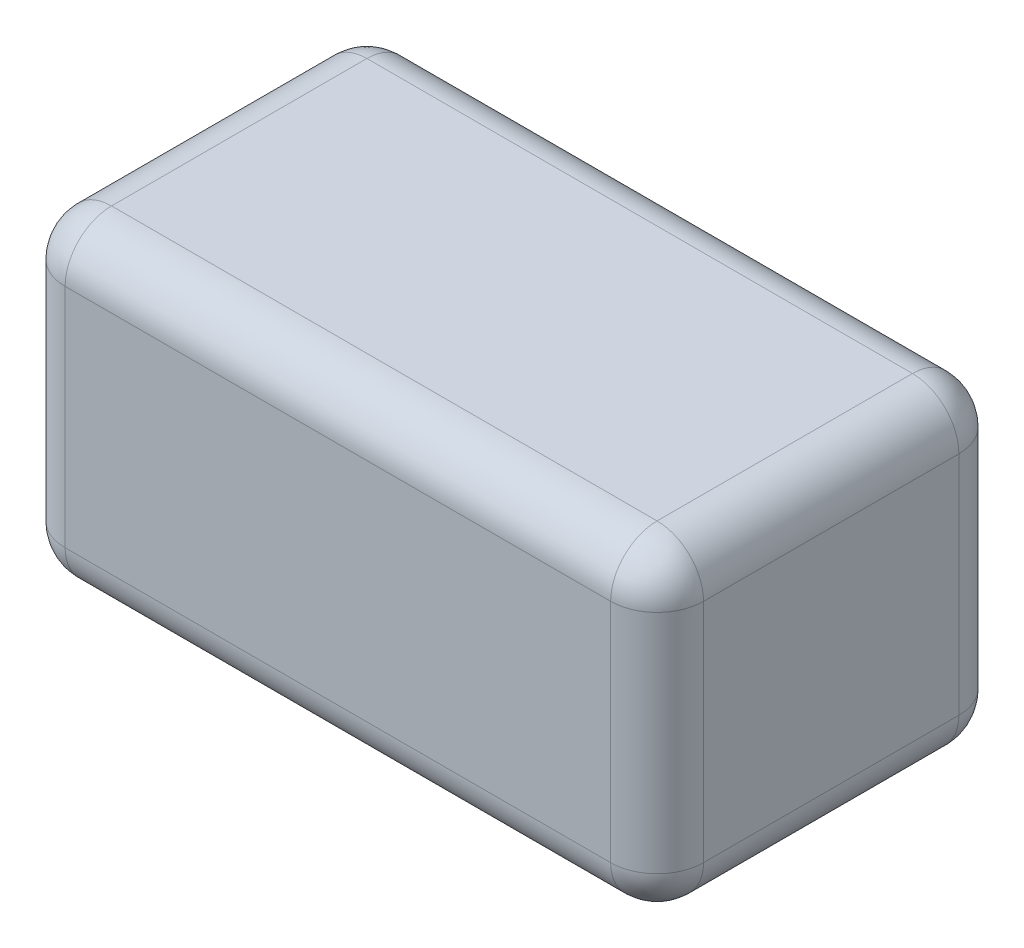
ISO-10303-21;
HEADER;
FILE_DESCRIPTION(('STEP AP214'),'2;1');
FILE_NAME('part.step','',(''),(''),'','','');
FILE_SCHEMA(('AUTOMOTIVE_DESIGN { 1 0 10303 214 1 1 1 1 }'));
ENDSEC;
DATA;
#1=APPLICATION_CONTEXT('core data for automotive mechanical design processes');
#2=APPLICATION_PROTOCOL_DEFINITION('international standard','automotive_design',2000,#1);
#3=PRODUCT_CONTEXT('',#1,'mechanical');
#4=PRODUCT('Part','Part','',(#3));
#5=PRODUCT_RELATED_PRODUCT_CATEGORY('part','',(#4));
#6=PRODUCT_DEFINITION_FORMATION('','',#4);
#7=PRODUCT_DEFINITION_CONTEXT('part definition',#1,'design');
#8=PRODUCT_DEFINITION('design','',#6,#7);
#9=PRODUCT_DEFINITION_SHAPE('','',#8);
#10=(LENGTH_UNIT() NAMED_UNIT(*) SI_UNIT(.MILLI.,.METRE.));
#11=(NAMED_UNIT(*) PLANE_ANGLE_UNIT() SI_UNIT($,.RADIAN.));
#12=(NAMED_UNIT(*) SI_UNIT($,.STERADIAN.) SOLID_ANGLE_UNIT());
#13=UNCERTAINTY_MEASURE_WITH_UNIT(LENGTH_MEASURE(1.E-05),#10,'distance_accuracy_value','');
#14=(GEOMETRIC_REPRESENTATION_CONTEXT(3) GLOBAL_UNCERTAINTY_ASSIGNED_CONTEXT((#13)) GLOBAL_UNIT_ASSIGNED_CONTEXT((#10,
#11,#12)) REPRESENTATION_CONTEXT('',''));
#15=CARTESIAN_POINT('',(0.,0.,0.));
#16=DIRECTION('',(0.,0.,1.));
#17=DIRECTION('',(1.,0.,0.));
#18=AXIS2_PLACEMENT_3D('',#15,#16,#17);
#19=CARTESIAN_POINT('',(0.47,0.195,0.52));
#20=DIRECTION('',(0.,1.,0.));
#21=DIRECTION('',(0.,0.,1.));
#22=AXIS2_PLACEMENT_3D('',#19,#20,#21);
#23=SPHERICAL_SURFACE('',#22,0.08);
#24=CARTESIAN_POINT('',(0.47,0.195,0.52));
#25=DIRECTION('',(0.,0.,-1.));
#26=DIRECTION('',(0.,1.,0.));
#27=AXIS2_PLACEMENT_3D('',#24,#25,#26);
#28=CIRCLE('',#27,0.08);
#29=CARTESIAN_POINT('',(0.47,0.275,0.52));
#30=VERTEX_POINT('',#29);
#31=CARTESIAN_POINT('',(0.55,0.195,0.52));
#32=VERTEX_POINT('',#31);
#33=EDGE_CURVE('E26',#30,#32,#28,.T.);
#34=ORIENTED_EDGE('',*,*,#33,.F.);
#35=CARTESIAN_POINT('',(0.47,0.195,0.52));
#36=DIRECTION('',(-1.,0.,0.));
#37=DIRECTION('',(0.,0.,1.));
#38=AXIS2_PLACEMENT_3D('',#35,#36,#37);
#39=CIRCLE('',#38,0.08);
#40=CARTESIAN_POINT('',(0.47,0.195,0.6));
#41=VERTEX_POINT('',#40);
#42=EDGE_CURVE('E236',#41,#30,#39,.T.);
#43=ORIENTED_EDGE('',*,*,#42,.F.);
#44=CARTESIAN_POINT('',(0.47,0.195,0.52));
#45=DIRECTION('',(0.,1.,0.));
#46=DIRECTION('',(0.,0.,1.));
#47=AXIS2_PLACEMENT_3D('',#44,#45,#46);
#48=CIRCLE('',#47,0.08);
#49=EDGE_CURVE('E11',#41,#32,#48,.T.);
#50=ORIENTED_EDGE('',*,*,#49,.T.);
#51=EDGE_LOOP('',(#34,#43,#50));
#52=FACE_BOUND('',#51,.T.);
#53=ADVANCED_FACE('F17',(#52),#23,.T.);
#54=CARTESIAN_POINT('',(-0.47,0.195,0.52));
#55=DIRECTION('',(0.,1.,0.));
#56=DIRECTION('',(-1.,0.,0.));
#57=AXIS2_PLACEMENT_3D('',#54,#55,#56);
#58=SPHERICAL_SURFACE('',#57,0.08);
#59=CARTESIAN_POINT('',(-0.47,0.195,0.52));
#60=DIRECTION('',(0.,0.,-1.));
#61=DIRECTION('',(-1.,0.,0.));
#62=AXIS2_PLACEMENT_3D('',#59,#60,#61);
#63=CIRCLE('',#62,0.08);
#64=CARTESIAN_POINT('',(-0.55,0.195,0.52));
#65=VERTEX_POINT('',#64);
#66=CARTESIAN_POINT('',(-0.47,0.275,0.52));
#67=VERTEX_POINT('',#66);
#68=EDGE_CURVE('E232',#65,#67,#63,.T.);
#69=ORIENTED_EDGE('',*,*,#68,.F.);
#70=CARTESIAN_POINT('',(-0.47,0.195,0.52));
#71=DIRECTION('',(0.,1.,0.));
#72=DIRECTION('',(-1.,0.,0.));
#73=AXIS2_PLACEMENT_3D('',#70,#71,#72);
#74=CIRCLE('',#73,0.08);
#75=CARTESIAN_POINT('',(-0.47,0.195,0.6));
#76=VERTEX_POINT('',#75);
#77=EDGE_CURVE('E20',#65,#76,#74,.T.);
#78=ORIENTED_EDGE('',*,*,#77,.T.);
#79=CARTESIAN_POINT('',(-0.47,0.195,0.52));
#80=DIRECTION('',(1.,0.,0.));
#81=DIRECTION('',(0.,1.,0.));
#82=AXIS2_PLACEMENT_3D('',#79,#80,#81);
#83=CIRCLE('',#82,0.08);
#84=EDGE_CURVE('E311',#67,#76,#83,.T.);
#85=ORIENTED_EDGE('',*,*,#84,.F.);
#86=EDGE_LOOP('',(#69,#78,#85));
#87=FACE_BOUND('',#86,.T.);
#88=ADVANCED_FACE('F324',(#87),#58,.T.);
#89=CARTESIAN_POINT('',(0.47,-0.595,0.52));
#90=DIRECTION('',(0.,-1.,0.));
#91=DIRECTION('',(1.,0.,0.));
#92=AXIS2_PLACEMENT_3D('',#89,#90,#91);
#93=CYLINDRICAL_SURFACE('',#92,0.08);
#94=CARTESIAN_POINT('',(0.47,-0.195,0.52));
#95=DIRECTION('',(0.,-1.,0.));
#96=DIRECTION('',(1.,0.,0.));
#97=AXIS2_PLACEMENT_3D('',#94,#95,#96);
#98=CIRCLE('',#97,0.08);
#99=CARTESIAN_POINT('',(0.55,-0.195,0.52));
#100=VERTEX_POINT('',#99);
#101=CARTESIAN_POINT('',(0.47,-0.195,0.6));
#102=VERTEX_POINT('',#101);
#103=EDGE_CURVE('E282',#100,#102,#98,.T.);
#104=ORIENTED_EDGE('',*,*,#103,.F.);
#105=DIRECTION('',(0.,1.,0.));
#106=VECTOR('',#105,1.);
#107=CARTESIAN_POINT('',(0.55,-0.195,0.52));
#108=LINE('',#107,#106);
#109=EDGE_CURVE('E278',#100,#32,#108,.T.);
#110=ORIENTED_EDGE('',*,*,#109,.T.);
#111=ORIENTED_EDGE('',*,*,#49,.F.);
#112=DIRECTION('',(0.,1.,0.));
#113=VECTOR('',#112,1.);
#114=CARTESIAN_POINT('',(0.47,-0.195,0.6));
#115=LINE('',#114,#113);
#116=EDGE_CURVE('E307',#102,#41,#115,.T.);
#117=ORIENTED_EDGE('',*,*,#116,.F.);
#118=EDGE_LOOP('',(#104,#110,#111,#117));
#119=FACE_BOUND('',#118,.T.);
#120=ADVANCED_FACE('F351',(#119),#93,.T.);
#121=CARTESIAN_POINT('',(0.47,0.195,0.84));
#122=DIRECTION('',(0.,0.,-1.));
#123=DIRECTION('',(0.,1.,0.));
#124=AXIS2_PLACEMENT_3D('',#121,#122,#123);
#125=CYLINDRICAL_SURFACE('',#124,0.08);
#126=DIRECTION('',(0.,0.,-1.));
#127=VECTOR('',#126,1.);
#128=CARTESIAN_POINT('',(0.55,0.195,0.52));
#129=LINE('',#128,#127);
#130=CARTESIAN_POINT('',(0.55,0.195,0.08));
#131=VERTEX_POINT('',#130);
#132=EDGE_CURVE('E276',#32,#131,#129,.T.);
#133=ORIENTED_EDGE('',*,*,#132,.T.);
#134=CARTESIAN_POINT('',(0.47,0.195,0.08));
#135=DIRECTION('',(0.,0.,1.));
#136=DIRECTION('',(1.,0.,0.));
#137=AXIS2_PLACEMENT_3D('',#134,#135,#136);
#138=CIRCLE('',#137,0.08);
#139=CARTESIAN_POINT('',(0.47,0.275,0.08));
#140=VERTEX_POINT('',#139);
#141=EDGE_CURVE('E272',#131,#140,#138,.T.);
#142=ORIENTED_EDGE('',*,*,#141,.T.);
#143=DIRECTION('',(0.,0.,-1.));
#144=VECTOR('',#143,1.);
#145=CARTESIAN_POINT('',(0.47,0.275,0.52));
#146=LINE('',#145,#144);
#147=EDGE_CURVE('E277',#30,#140,#146,.T.);
#148=ORIENTED_EDGE('',*,*,#147,.F.);
#149=ORIENTED_EDGE('',*,*,#33,.T.);
#150=EDGE_LOOP('',(#133,#142,#148,#149));
#151=FACE_BOUND('',#150,.T.);
#152=ADVANCED_FACE('F405',(#151),#125,.T.);
#153=CARTESIAN_POINT('',(-0.47,0.195,-0.24));
#154=DIRECTION('',(0.,0.,1.));
#155=DIRECTION('',(0.,1.,0.));
#156=AXIS2_PLACEMENT_3D('',#153,#154,#155);
#157=CYLINDRICAL_SURFACE('',#156,0.08);
#158=DIRECTION('',(0.,0.,1.));
#159=VECTOR('',#158,1.);
#160=CARTESIAN_POINT('',(-0.55,0.195,0.08));
#161=LINE('',#160,#159);
#162=CARTESIAN_POINT('',(-0.55,0.195,0.08));
#163=VERTEX_POINT('',#162);
#164=EDGE_CURVE('E291',#163,#65,#161,.T.);
#165=ORIENTED_EDGE('',*,*,#164,.T.);
#166=ORIENTED_EDGE('',*,*,#68,.T.);
#167=DIRECTION('',(0.,0.,1.));
#168=VECTOR('',#167,1.);
#169=CARTESIAN_POINT('',(-0.47,0.275,0.08));
#170=LINE('',#169,#168);
#171=CARTESIAN_POINT('',(-0.47,0.275,0.08));
#172=VERTEX_POINT('',#171);
#173=EDGE_CURVE('E298',#172,#67,#170,.T.);
#174=ORIENTED_EDGE('',*,*,#173,.F.);
#175=CARTESIAN_POINT('',(-0.47,0.195,0.08));
#176=DIRECTION('',(0.,0.,1.));
#177=DIRECTION('',(0.,1.,0.));
#178=AXIS2_PLACEMENT_3D('',#175,#176,#177);
#179=CIRCLE('',#178,0.08);
#180=EDGE_CURVE('E295',#172,#163,#179,.T.);
#181=ORIENTED_EDGE('',*,*,#180,.T.);
#182=EDGE_LOOP('',(#165,#166,#174,#181));
#183=FACE_BOUND('',#182,.T.);
#184=ADVANCED_FACE('F331',(#183),#157,.T.);
#185=CARTESIAN_POINT('',(-0.47,-0.595,0.52));
#186=DIRECTION('',(0.,-1.,0.));
#187=DIRECTION('',(0.,0.,1.));
#188=AXIS2_PLACEMENT_3D('',#185,#186,#187);
#189=CYLINDRICAL_SURFACE('',#188,0.08);
#190=CARTESIAN_POINT('',(-0.47,-0.195,0.52));
#191=DIRECTION('',(0.,-1.,0.));
#192=DIRECTION('',(0.,0.,1.));
#193=AXIS2_PLACEMENT_3D('',#190,#191,#192);
#194=CIRCLE('',#193,0.08);
#195=CARTESIAN_POINT('',(-0.47,-0.195,0.6));
#196=VERTEX_POINT('',#195);
#197=CARTESIAN_POINT('',(-0.55,-0.195,0.52));
#198=VERTEX_POINT('',#197);
#199=EDGE_CURVE('E264',#196,#198,#194,.T.);
#200=ORIENTED_EDGE('',*,*,#199,.F.);
#201=DIRECTION('',(0.,1.,0.));
#202=VECTOR('',#201,1.);
#203=CARTESIAN_POINT('',(-0.47,-0.195,0.6));
#204=LINE('',#203,#202);
#205=EDGE_CURVE('E269',#196,#76,#204,.T.);
#206=ORIENTED_EDGE('',*,*,#205,.T.);
#207=ORIENTED_EDGE('',*,*,#77,.F.);
#208=DIRECTION('',(0.,1.,0.));
#209=VECTOR('',#208,1.);
#210=CARTESIAN_POINT('',(-0.55,-0.195,0.52));
#211=LINE('',#210,#209);
#212=EDGE_CURVE('E268',#198,#65,#211,.T.);
#213=ORIENTED_EDGE('',*,*,#212,.F.);
#214=EDGE_LOOP('',(#200,#206,#207,#213));
#215=FACE_BOUND('',#214,.T.);
#216=ADVANCED_FACE('F327',(#215),#189,.T.);
#217=CARTESIAN_POINT('',(-0.79,0.195,0.52));
#218=DIRECTION('',(1.,0.,0.));
#219=DIRECTION('',(0.,1.,0.));
#220=AXIS2_PLACEMENT_3D('',#217,#218,#219);
#221=CYLINDRICAL_SURFACE('',#220,0.08);
#222=DIRECTION('',(1.,0.,0.));
#223=VECTOR('',#222,1.);
#224=CARTESIAN_POINT('',(-0.328638053961,0.275,0.52));
#225=LINE('',#224,#223);
#226=EDGE_CURVE('E259',#67,#30,#225,.T.);
#227=ORIENTED_EDGE('',*,*,#226,.F.);
#228=ORIENTED_EDGE('',*,*,#84,.T.);
#229=DIRECTION('',(1.,0.,0.));
#230=VECTOR('',#229,1.);
#231=CARTESIAN_POINT('',(-0.32830444115,0.195,0.6));
#232=LINE('',#231,#230);
#233=EDGE_CURVE('E39',#76,#41,#232,.T.);
#234=ORIENTED_EDGE('',*,*,#233,.T.);
#235=ORIENTED_EDGE('',*,*,#42,.T.);
#236=EDGE_LOOP('',(#227,#228,#234,#235));
#237=FACE_BOUND('',#236,.T.);
#238=ADVANCED_FACE('F404',(#237),#221,.T.);
#239=CARTESIAN_POINT('',(0.47,-0.195,0.52));
#240=DIRECTION('',(0.,-1.,0.));
#241=DIRECTION('',(1.,0.,0.));
#242=AXIS2_PLACEMENT_3D('',#239,#240,#241);
#243=SPHERICAL_SURFACE('',#242,0.08);
#244=ORIENTED_EDGE('',*,*,#103,.T.);
#245=CARTESIAN_POINT('',(0.47,-0.195,0.52));
#246=DIRECTION('',(1.,0.,0.));
#247=DIRECTION('',(0.,0.,1.));
#248=AXIS2_PLACEMENT_3D('',#245,#246,#247);
#249=CIRCLE('',#248,0.08);
#250=CARTESIAN_POINT('',(0.47,-0.275,0.52));
#251=VERTEX_POINT('',#250);
#252=EDGE_CURVE('E255',#102,#251,#249,.T.);
#253=ORIENTED_EDGE('',*,*,#252,.T.);
#254=CARTESIAN_POINT('',(0.47,-0.195,0.52));
#255=DIRECTION('',(0.,0.,1.));
#256=DIRECTION('',(0.,-1.,0.));
#257=AXIS2_PLACEMENT_3D('',#254,#255,#256);
#258=CIRCLE('',#257,0.08);
#259=EDGE_CURVE('E187',#251,#100,#258,.T.);
#260=ORIENTED_EDGE('',*,*,#259,.T.);
#261=EDGE_LOOP('',(#244,#253,#260));
#262=FACE_BOUND('',#261,.T.);
#263=ADVANCED_FACE('F355',(#262),#243,.T.);
#264=CARTESIAN_POINT('',(0.55,-0.275,0.6));
#265=DIRECTION('',(1.,0.,0.));
#266=DIRECTION('',(0.,1.,0.));
#267=AXIS2_PLACEMENT_3D('',#264,#265,#266);
#268=PLANE('',#267);
#269=DIRECTION('',(0.,0.,-1.));
#270=VECTOR('',#269,1.);
#271=CARTESIAN_POINT('',(0.55,-0.195,0.52));
#272=LINE('',#271,#270);
#273=CARTESIAN_POINT('',(0.55,-0.195,0.08));
#274=VERTEX_POINT('',#273);
#275=EDGE_CURVE('E254',#100,#274,#272,.T.);
#276=ORIENTED_EDGE('',*,*,#275,.T.);
#277=DIRECTION('',(0.,1.,0.));
#278=VECTOR('',#277,1.);
#279=CARTESIAN_POINT('',(0.55,-0.195,0.08));
#280=LINE('',#279,#278);
#281=EDGE_CURVE('E250',#274,#131,#280,.T.);
#282=ORIENTED_EDGE('',*,*,#281,.T.);
#283=ORIENTED_EDGE('',*,*,#132,.F.);
#284=ORIENTED_EDGE('',*,*,#109,.F.);
#285=EDGE_LOOP('',(#276,#282,#283,#284));
#286=FACE_BOUND('',#285,.T.);
#287=ADVANCED_FACE('F418',(#286),#268,.T.);
#288=CARTESIAN_POINT('',(0.47,0.195,0.08));
#289=DIRECTION('',(0.,1.,0.));
#290=DIRECTION('',(1.,0.,0.));
#291=AXIS2_PLACEMENT_3D('',#288,#289,#290);
#292=SPHERICAL_SURFACE('',#291,0.08);
#293=CARTESIAN_POINT('',(0.47,0.195,0.08));
#294=DIRECTION('',(0.,1.,0.));
#295=DIRECTION('',(1.,0.,0.));
#296=AXIS2_PLACEMENT_3D('',#293,#294,#295);
#297=CIRCLE('',#296,0.08);
#298=CARTESIAN_POINT('',(0.47,0.195,0.));
#299=VERTEX_POINT('',#298);
#300=EDGE_CURVE('E246',#131,#299,#297,.T.);
#301=ORIENTED_EDGE('',*,*,#300,.T.);
#302=CARTESIAN_POINT('',(0.47,0.195,0.08));
#303=DIRECTION('',(-1.,0.,0.));
#304=DIRECTION('',(0.,1.,0.));
#305=AXIS2_PLACEMENT_3D('',#302,#303,#304);
#306=CIRCLE('',#305,0.08);
#307=EDGE_CURVE('E245',#140,#299,#306,.T.);
#308=ORIENTED_EDGE('',*,*,#307,.F.);
#309=ORIENTED_EDGE('',*,*,#141,.F.);
#310=EDGE_LOOP('',(#301,#308,#309));
#311=FACE_BOUND('',#310,.T.);
#312=ADVANCED_FACE('F411',(#311),#292,.T.);
#313=CARTESIAN_POINT('',(-0.47,0.195,0.08));
#314=DIRECTION('',(0.,1.,0.));
#315=DIRECTION('',(0.,0.,-1.));
#316=AXIS2_PLACEMENT_3D('',#313,#314,#315);
#317=SPHERICAL_SURFACE('',#316,0.08);
#318=CARTESIAN_POINT('',(-0.47,0.195,0.08));
#319=DIRECTION('',(1.,0.,0.));
#320=DIRECTION('',(0.,0.,-1.));
#321=AXIS2_PLACEMENT_3D('',#318,#319,#320);
#322=CIRCLE('',#321,0.08);
#323=CARTESIAN_POINT('',(-0.47,0.195,0.));
#324=VERTEX_POINT('',#323);
#325=EDGE_CURVE('E208',#324,#172,#322,.T.);
#326=ORIENTED_EDGE('',*,*,#325,.F.);
#327=CARTESIAN_POINT('',(-0.47,0.195,0.08));
#328=DIRECTION('',(0.,1.,0.));
#329=DIRECTION('',(0.,0.,-1.));
#330=AXIS2_PLACEMENT_3D('',#327,#328,#329);
#331=CIRCLE('',#330,0.08);
#332=EDGE_CURVE('E161',#324,#163,#331,.T.);
#333=ORIENTED_EDGE('',*,*,#332,.T.);
#334=ORIENTED_EDGE('',*,*,#180,.F.);
#335=EDGE_LOOP('',(#326,#333,#334));
#336=FACE_BOUND('',#335,.T.);
#337=ADVANCED_FACE('F409',(#336),#317,.T.);
#338=CARTESIAN_POINT('',(-0.55,-0.275,0.));
#339=DIRECTION('',(-1.,0.,0.));
#340=DIRECTION('',(0.,0.,1.));
#341=AXIS2_PLACEMENT_3D('',#338,#339,#340);
#342=PLANE('',#341);
#343=DIRECTION('',(0.,0.,1.));
#344=VECTOR('',#343,1.);
#345=CARTESIAN_POINT('',(-0.55,-0.195,0.08));
#346=LINE('',#345,#344);
#347=CARTESIAN_POINT('',(-0.55,-0.195,0.08));
#348=VERTEX_POINT('',#347);
#349=EDGE_CURVE('E198',#348,#198,#346,.T.);
#350=ORIENTED_EDGE('',*,*,#349,.T.);
#351=ORIENTED_EDGE('',*,*,#212,.T.);
#352=ORIENTED_EDGE('',*,*,#164,.F.);
#353=DIRECTION('',(0.,1.,0.));
#354=VECTOR('',#353,1.);
#355=CARTESIAN_POINT('',(-0.55,-0.195,0.08));
#356=LINE('',#355,#354);
#357=EDGE_CURVE('E209',#348,#163,#356,.T.);
#358=ORIENTED_EDGE('',*,*,#357,.F.);
#359=EDGE_LOOP('',(#350,#351,#352,#358));
#360=FACE_BOUND('',#359,.T.);
#361=ADVANCED_FACE('F335',(#360),#342,.T.);
#362=CARTESIAN_POINT('',(-0.47,-0.195,0.52));
#363=DIRECTION('',(0.,-1.,0.));
#364=DIRECTION('',(0.,0.,1.));
#365=AXIS2_PLACEMENT_3D('',#362,#363,#364);
#366=SPHERICAL_SURFACE('',#365,0.08);
#367=ORIENTED_EDGE('',*,*,#199,.T.);
#368=CARTESIAN_POINT('',(-0.47,-0.195,0.52));
#369=DIRECTION('',(0.,0.,1.));
#370=DIRECTION('',(-1.,0.,0.));
#371=AXIS2_PLACEMENT_3D('',#368,#369,#370);
#372=CIRCLE('',#371,0.08);
#373=CARTESIAN_POINT('',(-0.47,-0.275,0.52));
#374=VERTEX_POINT('',#373);
#375=EDGE_CURVE('E213',#198,#374,#372,.T.);
#376=ORIENTED_EDGE('',*,*,#375,.T.);
#377=CARTESIAN_POINT('',(-0.47,-0.195,0.52));
#378=DIRECTION('',(-1.,0.,0.));
#379=DIRECTION('',(0.,-1.,0.));
#380=AXIS2_PLACEMENT_3D('',#377,#378,#379);
#381=CIRCLE('',#380,0.08);
#382=EDGE_CURVE('E194',#374,#196,#381,.T.);
#383=ORIENTED_EDGE('',*,*,#382,.T.);
#384=EDGE_LOOP('',(#367,#376,#383));
#385=FACE_BOUND('',#384,.T.);
#386=ADVANCED_FACE('F343',(#385),#366,.T.);
#387=CARTESIAN_POINT('',(-0.55,-0.275,0.6));
#388=DIRECTION('',(0.,0.,1.));
#389=DIRECTION('',(1.,0.,0.));
#390=AXIS2_PLACEMENT_3D('',#387,#388,#389);
#391=PLANE('',#390);
#392=ORIENTED_EDGE('',*,*,#233,.F.);
#393=ORIENTED_EDGE('',*,*,#205,.F.);
#394=DIRECTION('',(1.,0.,0.));
#395=VECTOR('',#394,1.);
#396=CARTESIAN_POINT('',(-0.32830444115,-0.195,0.6));
#397=LINE('',#396,#395);
#398=EDGE_CURVE('E199',#196,#102,#397,.T.);
#399=ORIENTED_EDGE('',*,*,#398,.T.);
#400=ORIENTED_EDGE('',*,*,#116,.T.);
#401=EDGE_LOOP('',(#392,#393,#399,#400));
#402=FACE_BOUND('',#401,.T.);
#403=ADVANCED_FACE('F349',(#402),#391,.T.);
#404=CARTESIAN_POINT('',(0.,0.275,0.));
#405=DIRECTION('',(0.,1.,0.));
#406=DIRECTION('',(1.,0.,0.));
#407=AXIS2_PLACEMENT_3D('',#404,#405,#406);
#408=PLANE('',#407);
#409=ORIENTED_EDGE('',*,*,#226,.T.);
#410=ORIENTED_EDGE('',*,*,#147,.T.);
#411=DIRECTION('',(-1.,0.,0.));
#412=VECTOR('',#411,1.);
#413=CARTESIAN_POINT('',(0.328638054203,0.275,0.08));
#414=LINE('',#413,#412);
#415=EDGE_CURVE('E202',#140,#172,#414,.T.);
#416=ORIENTED_EDGE('',*,*,#415,.T.);
#417=ORIENTED_EDGE('',*,*,#173,.T.);
#418=EDGE_LOOP('',(#409,#410,#416,#417));
#419=FACE_BOUND('',#418,.T.);
#420=ADVANCED_FACE('F407',(#419),#408,.T.);
#421=CARTESIAN_POINT('',(0.47,-0.195,0.84));
#422=DIRECTION('',(0.,0.,1.));
#423=DIRECTION('',(0.,-1.,0.));
#424=AXIS2_PLACEMENT_3D('',#421,#422,#423);
#425=CYLINDRICAL_SURFACE('',#424,0.08);
#426=ORIENTED_EDGE('',*,*,#275,.F.);
#427=ORIENTED_EDGE('',*,*,#259,.F.);
#428=DIRECTION('',(0.,0.,-1.));
#429=VECTOR('',#428,1.);
#430=CARTESIAN_POINT('',(0.47,-0.275,0.52));
#431=LINE('',#430,#429);
#432=CARTESIAN_POINT('',(0.47,-0.275,0.08));
#433=VERTEX_POINT('',#432);
#434=EDGE_CURVE('E191',#251,#433,#431,.T.);
#435=ORIENTED_EDGE('',*,*,#434,.T.);
#436=CARTESIAN_POINT('',(0.47,-0.195,0.08));
#437=DIRECTION('',(0.,0.,-1.));
#438=DIRECTION('',(1.,0.,0.));
#439=AXIS2_PLACEMENT_3D('',#436,#437,#438);
#440=CIRCLE('',#439,0.08);
#441=EDGE_CURVE('E192',#274,#433,#440,.T.);
#442=ORIENTED_EDGE('',*,*,#441,.F.);
#443=EDGE_LOOP('',(#426,#427,#435,#442));
#444=FACE_BOUND('',#443,.T.);
#445=ADVANCED_FACE('F362',(#444),#425,.T.);
#446=CARTESIAN_POINT('',(0.47,-0.595,0.08));
#447=DIRECTION('',(0.,-1.,0.));
#448=DIRECTION('',(0.,0.,-1.));
#449=AXIS2_PLACEMENT_3D('',#446,#447,#448);
#450=CYLINDRICAL_SURFACE('',#449,0.08);
#451=CARTESIAN_POINT('',(0.47,-0.195,0.08));
#452=DIRECTION('',(0.,-1.,0.));
#453=DIRECTION('',(0.,0.,-1.));
#454=AXIS2_PLACEMENT_3D('',#451,#452,#453);
#455=CIRCLE('',#454,0.08);
#456=CARTESIAN_POINT('',(0.47,-0.195,0.));
#457=VERTEX_POINT('',#456);
#458=EDGE_CURVE('E188',#457,#274,#455,.T.);
#459=ORIENTED_EDGE('',*,*,#458,.F.);
#460=DIRECTION('',(0.,1.,0.));
#461=VECTOR('',#460,1.);
#462=CARTESIAN_POINT('',(0.47,-0.195,0.));
#463=LINE('',#462,#461);
#464=EDGE_CURVE('E143',#457,#299,#463,.T.);
#465=ORIENTED_EDGE('',*,*,#464,.T.);
#466=ORIENTED_EDGE('',*,*,#300,.F.);
#467=ORIENTED_EDGE('',*,*,#281,.F.);
#468=EDGE_LOOP('',(#459,#465,#466,#467));
#469=FACE_BOUND('',#468,.T.);
#470=ADVANCED_FACE('F382',(#469),#450,.T.);
#471=CARTESIAN_POINT('',(-0.47,-0.595,0.08));
#472=DIRECTION('',(0.,-1.,0.));
#473=DIRECTION('',(-1.,0.,0.));
#474=AXIS2_PLACEMENT_3D('',#471,#472,#473);
#475=CYLINDRICAL_SURFACE('',#474,0.08);
#476=CARTESIAN_POINT('',(-0.47,-0.195,0.08));
#477=DIRECTION('',(0.,-1.,0.));
#478=DIRECTION('',(-1.,0.,0.));
#479=AXIS2_PLACEMENT_3D('',#476,#477,#478);
#480=CIRCLE('',#479,0.08);
#481=CARTESIAN_POINT('',(-0.47,-0.195,0.));
#482=VERTEX_POINT('',#481);
#483=EDGE_CURVE('E158',#348,#482,#480,.T.);
#484=ORIENTED_EDGE('',*,*,#483,.F.);
#485=ORIENTED_EDGE('',*,*,#357,.T.);
#486=ORIENTED_EDGE('',*,*,#332,.F.);
#487=DIRECTION('',(0.,1.,0.));
#488=VECTOR('',#487,1.);
#489=CARTESIAN_POINT('',(-0.47,-0.195,0.));
#490=LINE('',#489,#488);
#491=EDGE_CURVE('E141',#482,#324,#490,.T.);
#492=ORIENTED_EDGE('',*,*,#491,.F.);
#493=EDGE_LOOP('',(#484,#485,#486,#492));
#494=FACE_BOUND('',#493,.T.);
#495=ADVANCED_FACE('F156',(#494),#475,.T.);
#496=CARTESIAN_POINT('',(-0.47,-0.195,-0.24));
#497=DIRECTION('',(0.,0.,-1.));
#498=DIRECTION('',(0.,-1.,0.));
#499=AXIS2_PLACEMENT_3D('',#496,#497,#498);
#500=CYLINDRICAL_SURFACE('',#499,0.08);
#501=ORIENTED_EDGE('',*,*,#349,.F.);
#502=CARTESIAN_POINT('',(-0.47,-0.195,0.08));
#503=DIRECTION('',(0.,0.,-1.));
#504=DIRECTION('',(0.,-1.,0.));
#505=AXIS2_PLACEMENT_3D('',#502,#503,#504);
#506=CIRCLE('',#505,0.08);
#507=CARTESIAN_POINT('',(-0.47,-0.275,0.08));
#508=VERTEX_POINT('',#507);
#509=EDGE_CURVE('E169',#508,#348,#506,.T.);
#510=ORIENTED_EDGE('',*,*,#509,.F.);
#511=DIRECTION('',(0.,0.,1.));
#512=VECTOR('',#511,1.);
#513=CARTESIAN_POINT('',(-0.47,-0.275,0.08));
#514=LINE('',#513,#512);
#515=EDGE_CURVE('E216',#508,#374,#514,.T.);
#516=ORIENTED_EDGE('',*,*,#515,.T.);
#517=ORIENTED_EDGE('',*,*,#375,.F.);
#518=EDGE_LOOP('',(#501,#510,#516,#517));
#519=FACE_BOUND('',#518,.T.);
#520=ADVANCED_FACE('F339',(#519),#500,.T.);
#521=CARTESIAN_POINT('',(-0.79,-0.195,0.52));
#522=DIRECTION('',(-1.,0.,0.));
#523=DIRECTION('',(0.,-1.,0.));
#524=AXIS2_PLACEMENT_3D('',#521,#522,#523);
#525=CYLINDRICAL_SURFACE('',#524,0.08);
#526=ORIENTED_EDGE('',*,*,#398,.F.);
#527=ORIENTED_EDGE('',*,*,#382,.F.);
#528=DIRECTION('',(1.,0.,0.));
#529=VECTOR('',#528,1.);
#530=CARTESIAN_POINT('',(-0.328638053961,-0.275,0.52));
#531=LINE('',#530,#529);
#532=EDGE_CURVE('E205',#374,#251,#531,.T.);
#533=ORIENTED_EDGE('',*,*,#532,.T.);
#534=ORIENTED_EDGE('',*,*,#252,.F.);
#535=EDGE_LOOP('',(#526,#527,#533,#534));
#536=FACE_BOUND('',#535,.T.);
#537=ADVANCED_FACE('F345',(#536),#525,.T.);
#538=CARTESIAN_POINT('',(0.79,0.195,0.08));
#539=DIRECTION('',(-1.,0.,0.));
#540=DIRECTION('',(0.,1.,0.));
#541=AXIS2_PLACEMENT_3D('',#538,#539,#540);
#542=CYLINDRICAL_SURFACE('',#541,0.08);
#543=ORIENTED_EDGE('',*,*,#415,.F.);
#544=ORIENTED_EDGE('',*,*,#307,.T.);
#545=DIRECTION('',(-1.,0.,0.));
#546=VECTOR('',#545,1.);
#547=CARTESIAN_POINT('',(0.32830444115,0.195,0.));
#548=LINE('',#547,#546);
#549=EDGE_CURVE('E181',#299,#324,#548,.T.);
#550=ORIENTED_EDGE('',*,*,#549,.T.);
#551=ORIENTED_EDGE('',*,*,#325,.T.);
#552=EDGE_LOOP('',(#543,#544,#550,#551));
#553=FACE_BOUND('',#552,.T.);
#554=ADVANCED_FACE('F376',(#553),#542,.T.);
#555=CARTESIAN_POINT('',(0.47,-0.195,0.08));
#556=DIRECTION('',(0.,-1.,0.));
#557=DIRECTION('',(0.,0.,-1.));
#558=AXIS2_PLACEMENT_3D('',#555,#556,#557);
#559=SPHERICAL_SURFACE('',#558,0.08);
#560=ORIENTED_EDGE('',*,*,#441,.T.);
#561=CARTESIAN_POINT('',(0.47,-0.195,0.08));
#562=DIRECTION('',(1.,0.,0.));
#563=DIRECTION('',(0.,-1.,0.));
#564=AXIS2_PLACEMENT_3D('',#561,#562,#563);
#565=CIRCLE('',#564,0.08);
#566=EDGE_CURVE('E174',#433,#457,#565,.T.);
#567=ORIENTED_EDGE('',*,*,#566,.T.);
#568=ORIENTED_EDGE('',*,*,#458,.T.);
#569=EDGE_LOOP('',(#560,#567,#568));
#570=FACE_BOUND('',#569,.T.);
#571=ADVANCED_FACE('F384',(#570),#559,.T.);
#572=CARTESIAN_POINT('',(-0.47,-0.195,0.08));
#573=DIRECTION('',(0.,-1.,0.));
#574=DIRECTION('',(-1.,0.,0.));
#575=AXIS2_PLACEMENT_3D('',#572,#573,#574);
#576=SPHERICAL_SURFACE('',#575,0.08);
#577=CARTESIAN_POINT('',(-0.47,-0.195,0.08));
#578=DIRECTION('',(-1.,0.,0.));
#579=DIRECTION('',(0.,0.,-1.));
#580=AXIS2_PLACEMENT_3D('',#577,#578,#579);
#581=CIRCLE('',#580,0.08);
#582=EDGE_CURVE('E167',#482,#508,#581,.T.);
#583=ORIENTED_EDGE('',*,*,#582,.T.);
#584=ORIENTED_EDGE('',*,*,#509,.T.);
#585=ORIENTED_EDGE('',*,*,#483,.T.);
#586=EDGE_LOOP('',(#583,#584,#585));
#587=FACE_BOUND('',#586,.T.);
#588=ADVANCED_FACE('F166',(#587),#576,.T.);
#589=CARTESIAN_POINT('',(0.,-0.275,0.));
#590=DIRECTION('',(0.,1.,0.));
#591=DIRECTION('',(1.,0.,0.));
#592=AXIS2_PLACEMENT_3D('',#589,#590,#591);
#593=PLANE('',#592);
#594=ORIENTED_EDGE('',*,*,#532,.F.);
#595=ORIENTED_EDGE('',*,*,#515,.F.);
#596=DIRECTION('',(-1.,0.,0.));
#597=VECTOR('',#596,1.);
#598=CARTESIAN_POINT('',(0.328638054203,-0.275,0.08));
#599=LINE('',#598,#597);
#600=EDGE_CURVE('E150',#433,#508,#599,.T.);
#601=ORIENTED_EDGE('',*,*,#600,.F.);
#602=ORIENTED_EDGE('',*,*,#434,.F.);
#603=EDGE_LOOP('',(#594,#595,#601,#602));
#604=FACE_BOUND('',#603,.T.);
#605=ADVANCED_FACE('F392',(#604),#593,.F.);
#606=CARTESIAN_POINT('',(0.55,-0.275,0.));
#607=DIRECTION('',(0.,0.,-1.));
#608=DIRECTION('',(0.,-1.,0.));
#609=AXIS2_PLACEMENT_3D('',#606,#607,#608);
#610=PLANE('',#609);
#611=ORIENTED_EDGE('',*,*,#549,.F.);
#612=ORIENTED_EDGE('',*,*,#464,.F.);
#613=DIRECTION('',(-1.,0.,0.));
#614=VECTOR('',#613,1.);
#615=CARTESIAN_POINT('',(0.32830444115,-0.195,0.));
#616=LINE('',#615,#614);
#617=EDGE_CURVE('E138',#457,#482,#616,.T.);
#618=ORIENTED_EDGE('',*,*,#617,.T.);
#619=ORIENTED_EDGE('',*,*,#491,.T.);
#620=EDGE_LOOP('',(#611,#612,#618,#619));
#621=FACE_BOUND('',#620,.T.);
#622=ADVANCED_FACE('F140',(#621),#610,.T.);
#623=CARTESIAN_POINT('',(0.79,-0.195,0.08));
#624=DIRECTION('',(1.,0.,0.));
#625=DIRECTION('',(0.,-1.,0.));
#626=AXIS2_PLACEMENT_3D('',#623,#624,#625);
#627=CYLINDRICAL_SURFACE('',#626,0.08);
#628=ORIENTED_EDGE('',*,*,#600,.T.);
#629=ORIENTED_EDGE('',*,*,#582,.F.);
#630=ORIENTED_EDGE('',*,*,#617,.F.);
#631=ORIENTED_EDGE('',*,*,#566,.F.);
#632=EDGE_LOOP('',(#628,#629,#630,#631));
#633=FACE_BOUND('',#632,.T.);
#634=ADVANCED_FACE('F172',(#633),#627,.T.);
#635=CLOSED_SHELL('',(#53,#88,#120,#152,#184,#216,#238,#263,#287,#312,#337,#361,#386,#403,#420,
#445,#470,#495,#520,#537,#554,#571,#588,#605,#622,#634));
#636=MANIFOLD_SOLID_BREP('B1',#635);
#637=ADVANCED_BREP_SHAPE_REPRESENTATION('',(#18,#636),#14);
#638=SHAPE_DEFINITION_REPRESENTATION(#9,#637);
ENDSEC;
END-ISO-10303-21;
